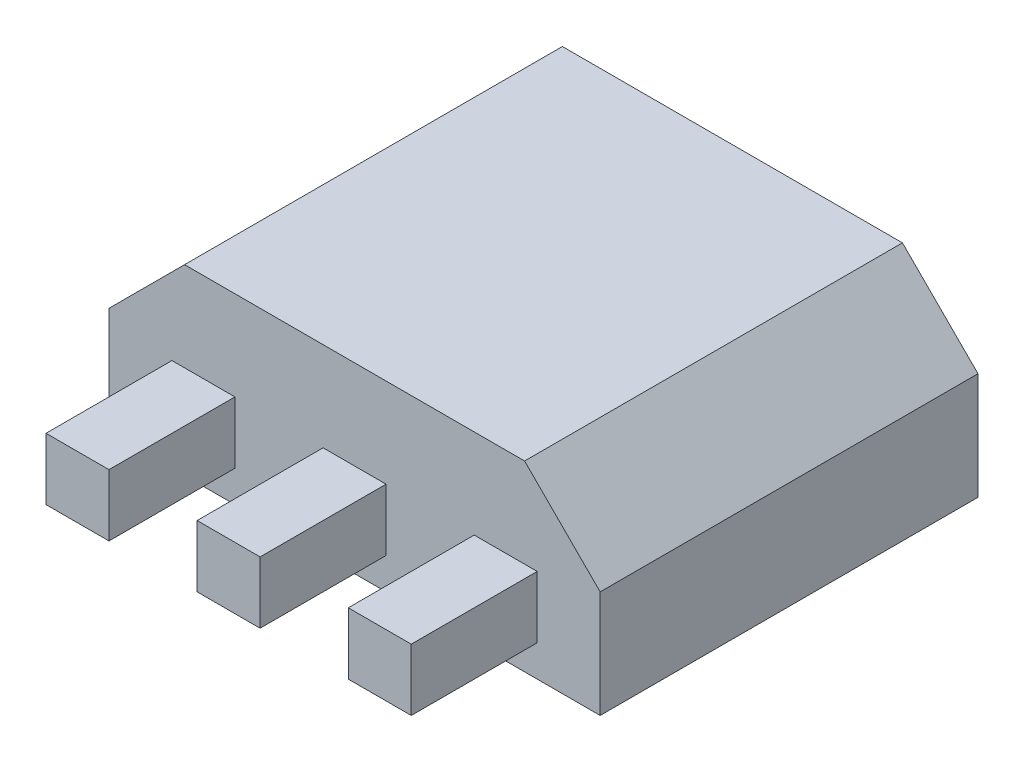
ISO-10303-21;
HEADER;
FILE_DESCRIPTION(('STEP AP214'),'2;1');
FILE_NAME('part.step','',(''),(''),'','','');
FILE_SCHEMA(('AUTOMOTIVE_DESIGN { 1 0 10303 214 1 1 1 1 }'));
ENDSEC;
DATA;
#1=APPLICATION_CONTEXT('core data for automotive mechanical design processes');
#2=APPLICATION_PROTOCOL_DEFINITION('international standard','automotive_design',2000,#1);
#3=PRODUCT_CONTEXT('',#1,'mechanical');
#4=PRODUCT('Part','Part','',(#3));
#5=PRODUCT_RELATED_PRODUCT_CATEGORY('part','',(#4));
#6=PRODUCT_DEFINITION_FORMATION('','',#4);
#7=PRODUCT_DEFINITION_CONTEXT('part definition',#1,'design');
#8=PRODUCT_DEFINITION('design','',#6,#7);
#9=PRODUCT_DEFINITION_SHAPE('','',#8);
#10=(LENGTH_UNIT() NAMED_UNIT(*) SI_UNIT(.MILLI.,.METRE.));
#11=(NAMED_UNIT(*) PLANE_ANGLE_UNIT() SI_UNIT($,.RADIAN.));
#12=(NAMED_UNIT(*) SI_UNIT($,.STERADIAN.) SOLID_ANGLE_UNIT());
#13=UNCERTAINTY_MEASURE_WITH_UNIT(LENGTH_MEASURE(1.E-05),#10,'distance_accuracy_value','');
#14=(GEOMETRIC_REPRESENTATION_CONTEXT(3) GLOBAL_UNCERTAINTY_ASSIGNED_CONTEXT((#13)) GLOBAL_UNIT_ASSIGNED_CONTEXT((#10,
#11,#12)) REPRESENTATION_CONTEXT('',''));
#15=CARTESIAN_POINT('',(0.,0.,0.));
#16=DIRECTION('',(0.,0.,1.));
#17=DIRECTION('',(1.,0.,0.));
#18=AXIS2_PLACEMENT_3D('',#15,#16,#17);
#19=CARTESIAN_POINT('',(0.,1.45,0.));
#20=DIRECTION('',(0.,0.,-1.));
#21=DIRECTION('',(-1.,0.,0.));
#22=AXIS2_PLACEMENT_3D('',#19,#20,#21);
#23=PLANE('',#22);
#24=DIRECTION('',(0.,-1.,0.));
#25=VECTOR('',#24,1.);
#26=CARTESIAN_POINT('',(1.7,0.740574160750156,0.));
#27=LINE('',#26,#25);
#28=CARTESIAN_POINT('',(1.7,0.740574160750156,0.));
#29=VERTEX_POINT('',#28);
#30=CARTESIAN_POINT('',(1.7,0.25,0.));
#31=VERTEX_POINT('',#30);
#32=EDGE_CURVE('E182',#29,#31,#27,.T.);
#33=ORIENTED_EDGE('',*,*,#32,.F.);
#34=DIRECTION('',(-1.,0.,0.));
#35=VECTOR('',#34,1.);
#36=CARTESIAN_POINT('',(1.7,0.740574160750156,0.));
#37=LINE('',#36,#35);
#38=CARTESIAN_POINT('',(2.2,0.740574160750157,0.));
#39=VERTEX_POINT('',#38);
#40=EDGE_CURVE('E195',#39,#29,#37,.T.);
#41=ORIENTED_EDGE('',*,*,#40,.F.);
#42=DIRECTION('',(0.,1.,0.));
#43=VECTOR('',#42,1.);
#44=CARTESIAN_POINT('',(2.2,0.740574160750157,0.));
#45=LINE('',#44,#43);
#46=CARTESIAN_POINT('',(2.2,0.25,0.));
#47=VERTEX_POINT('',#46);
#48=EDGE_CURVE('E204',#47,#39,#45,.T.);
#49=ORIENTED_EDGE('',*,*,#48,.F.);
#50=DIRECTION('',(1.,0.,0.));
#51=VECTOR('',#50,1.);
#52=CARTESIAN_POINT('',(1.7,0.25,0.));
#53=LINE('',#52,#51);
#54=EDGE_CURVE('E185',#31,#47,#53,.T.);
#55=ORIENTED_EDGE('',*,*,#54,.F.);
#56=EDGE_LOOP('',(#33,#41,#49,#55));
#57=FACE_BOUND('',#56,.T.);
#58=DIRECTION('',(1.,0.,0.));
#59=VECTOR('',#58,1.);
#60=CARTESIAN_POINT('',(0.,1.45,0.));
#61=LINE('',#60,#59);
#62=CARTESIAN_POINT('',(0.599999999999999,1.45,0.));
#63=VERTEX_POINT('',#62);
#64=CARTESIAN_POINT('',(3.3,1.45,0.));
#65=VERTEX_POINT('',#64);
#66=EDGE_CURVE('E254',#63,#65,#61,.T.);
#67=ORIENTED_EDGE('',*,*,#66,.F.);
#68=DIRECTION('',(0.707106781186546,0.707106781186549,0.));
#69=VECTOR('',#68,1.);
#70=CARTESIAN_POINT('',(0.599999999999999,1.45,0.));
#71=LINE('',#70,#69);
#72=CARTESIAN_POINT('',(0.,0.849999999999999,0.));
#73=VERTEX_POINT('',#72);
#74=EDGE_CURVE('E287',#63,#73,#71,.F.);
#75=ORIENTED_EDGE('',*,*,#74,.T.);
#76=DIRECTION('',(0.,-1.,0.));
#77=VECTOR('',#76,1.);
#78=CARTESIAN_POINT('',(0.,1.45,0.));
#79=LINE('',#78,#77);
#80=CARTESIAN_POINT('',(0.,0.,0.));
#81=VERTEX_POINT('',#80);
#82=EDGE_CURVE('E277',#73,#81,#79,.T.);
#83=ORIENTED_EDGE('',*,*,#82,.T.);
#84=DIRECTION('',(1.,0.,0.));
#85=VECTOR('',#84,1.);
#86=CARTESIAN_POINT('',(0.,0.,0.));
#87=LINE('',#86,#85);
#88=CARTESIAN_POINT('',(3.9,0.,0.));
#89=VERTEX_POINT('',#88);
#90=EDGE_CURVE('E264',#81,#89,#87,.T.);
#91=ORIENTED_EDGE('',*,*,#90,.T.);
#92=DIRECTION('',(0.,-1.,0.));
#93=VECTOR('',#92,1.);
#94=CARTESIAN_POINT('',(3.9,1.45,0.));
#95=LINE('',#94,#93);
#96=CARTESIAN_POINT('',(3.9,0.849999999999997,0.));
#97=VERTEX_POINT('',#96);
#98=EDGE_CURVE('E275',#97,#89,#95,.T.);
#99=ORIENTED_EDGE('',*,*,#98,.F.);
#100=DIRECTION('',(0.707106781186546,-0.707106781186549,0.));
#101=VECTOR('',#100,1.);
#102=CARTESIAN_POINT('',(3.3,1.45,0.));
#103=LINE('',#102,#101);
#104=EDGE_CURVE('E285',#97,#65,#103,.F.);
#105=ORIENTED_EDGE('',*,*,#104,.T.);
#106=EDGE_LOOP('',(#67,#75,#83,#91,#99,#105));
#107=FACE_BOUND('',#106,.T.);
#108=DIRECTION('',(0.,-1.,0.));
#109=VECTOR('',#108,1.);
#110=CARTESIAN_POINT('',(0.5,0.740574160750157,0.));
#111=LINE('',#110,#109);
#112=CARTESIAN_POINT('',(0.5,0.740574160750157,0.));
#113=VERTEX_POINT('',#112);
#114=CARTESIAN_POINT('',(0.5,0.25,0.));
#115=VERTEX_POINT('',#114);
#116=EDGE_CURVE('E220',#113,#115,#111,.T.);
#117=ORIENTED_EDGE('',*,*,#116,.F.);
#118=DIRECTION('',(-1.,0.,0.));
#119=VECTOR('',#118,1.);
#120=CARTESIAN_POINT('',(0.5,0.740574160750157,0.));
#121=LINE('',#120,#119);
#122=CARTESIAN_POINT('',(1.,0.740574160750157,0.));
#123=VERTEX_POINT('',#122);
#124=EDGE_CURVE('E225',#123,#113,#121,.T.);
#125=ORIENTED_EDGE('',*,*,#124,.F.);
#126=DIRECTION('',(0.,1.,0.));
#127=VECTOR('',#126,1.);
#128=CARTESIAN_POINT('',(1.,0.740574160750157,0.));
#129=LINE('',#128,#127);
#130=CARTESIAN_POINT('',(1.,0.25,0.));
#131=VERTEX_POINT('',#130);
#132=EDGE_CURVE('E237',#131,#123,#129,.T.);
#133=ORIENTED_EDGE('',*,*,#132,.F.);
#134=DIRECTION('',(1.,0.,0.));
#135=VECTOR('',#134,1.);
#136=CARTESIAN_POINT('',(0.5,0.25,0.));
#137=LINE('',#136,#135);
#138=EDGE_CURVE('E234',#115,#131,#137,.T.);
#139=ORIENTED_EDGE('',*,*,#138,.F.);
#140=EDGE_LOOP('',(#117,#125,#133,#139));
#141=FACE_BOUND('',#140,.T.);
#142=DIRECTION('',(0.,-1.,0.));
#143=VECTOR('',#142,1.);
#144=CARTESIAN_POINT('',(2.9,0.740574160750157,0.));
#145=LINE('',#144,#143);
#146=CARTESIAN_POINT('',(2.9,0.740574160750157,0.));
#147=VERTEX_POINT('',#146);
#148=CARTESIAN_POINT('',(2.9,0.25,0.));
#149=VERTEX_POINT('',#148);
#150=EDGE_CURVE('E181',#147,#149,#145,.T.);
#151=ORIENTED_EDGE('',*,*,#150,.F.);
#152=DIRECTION('',(-1.,0.,0.));
#153=VECTOR('',#152,1.);
#154=CARTESIAN_POINT('',(2.9,0.740574160750157,0.));
#155=LINE('',#154,#153);
#156=CARTESIAN_POINT('',(3.4,0.740574160750157,0.));
#157=VERTEX_POINT('',#156);
#158=EDGE_CURVE('E178',#157,#147,#155,.T.);
#159=ORIENTED_EDGE('',*,*,#158,.F.);
#160=DIRECTION('',(0.,1.,0.));
#161=VECTOR('',#160,1.);
#162=CARTESIAN_POINT('',(3.4,0.740574160750157,0.));
#163=LINE('',#162,#161);
#164=CARTESIAN_POINT('',(3.4,0.25,0.));
#165=VERTEX_POINT('',#164);
#166=EDGE_CURVE('E57',#165,#157,#163,.T.);
#167=ORIENTED_EDGE('',*,*,#166,.F.);
#168=DIRECTION('',(1.,0.,0.));
#169=VECTOR('',#168,1.);
#170=CARTESIAN_POINT('',(2.9,0.25,0.));
#171=LINE('',#170,#169);
#172=EDGE_CURVE('E52',#149,#165,#171,.T.);
#173=ORIENTED_EDGE('',*,*,#172,.F.);
#174=EDGE_LOOP('',(#151,#159,#167,#173));
#175=FACE_BOUND('',#174,.T.);
#176=ADVANCED_FACE('F36',(#57,#107,#141,#175),#23,.F.);
#177=CARTESIAN_POINT('',(0.,1.45,0.));
#178=DIRECTION('',(1.,0.,0.));
#179=DIRECTION('',(0.,0.,-1.));
#180=AXIS2_PLACEMENT_3D('',#177,#178,#179);
#181=PLANE('',#180);
#182=ORIENTED_EDGE('',*,*,#82,.F.);
#183=DIRECTION('',(0.,0.,-1.));
#184=VECTOR('',#183,1.);
#185=CARTESIAN_POINT('',(0.,0.849999999999999,0.));
#186=LINE('',#185,#184);
#187=CARTESIAN_POINT('',(0.,0.849999999999999,-3.));
#188=VERTEX_POINT('',#187);
#189=EDGE_CURVE('E289',#73,#188,#186,.T.);
#190=ORIENTED_EDGE('',*,*,#189,.T.);
#191=DIRECTION('',(0.,-1.,0.));
#192=VECTOR('',#191,1.);
#193=CARTESIAN_POINT('',(0.,1.45,-3.));
#194=LINE('',#193,#192);
#195=CARTESIAN_POINT('',(0.,0.,-3.));
#196=VERTEX_POINT('',#195);
#197=EDGE_CURVE('E261',#188,#196,#194,.T.);
#198=ORIENTED_EDGE('',*,*,#197,.T.);
#199=DIRECTION('',(0.,0.,1.));
#200=VECTOR('',#199,1.);
#201=CARTESIAN_POINT('',(0.,0.,0.));
#202=LINE('',#201,#200);
#203=EDGE_CURVE('E253',#196,#81,#202,.T.);
#204=ORIENTED_EDGE('',*,*,#203,.T.);
#205=EDGE_LOOP('',(#182,#190,#198,#204));
#206=FACE_BOUND('',#205,.T.);
#207=ADVANCED_FACE('F310',(#206),#181,.F.);
#208=CARTESIAN_POINT('',(3.9,1.45,0.));
#209=DIRECTION('',(-1.,0.,0.));
#210=DIRECTION('',(0.,0.,1.));
#211=AXIS2_PLACEMENT_3D('',#208,#209,#210);
#212=PLANE('',#211);
#213=DIRECTION('',(0.,-1.,0.));
#214=VECTOR('',#213,1.);
#215=CARTESIAN_POINT('',(3.9,1.45,-3.));
#216=LINE('',#215,#214);
#217=CARTESIAN_POINT('',(3.9,0.849999999999997,-3.));
#218=VERTEX_POINT('',#217);
#219=CARTESIAN_POINT('',(3.9,0.,-3.));
#220=VERTEX_POINT('',#219);
#221=EDGE_CURVE('E273',#218,#220,#216,.T.);
#222=ORIENTED_EDGE('',*,*,#221,.F.);
#223=DIRECTION('',(0.,0.,1.));
#224=VECTOR('',#223,1.);
#225=CARTESIAN_POINT('',(3.9,0.849999999999997,0.));
#226=LINE('',#225,#224);
#227=EDGE_CURVE('E11',#218,#97,#226,.T.);
#228=ORIENTED_EDGE('',*,*,#227,.T.);
#229=ORIENTED_EDGE('',*,*,#98,.T.);
#230=DIRECTION('',(0.,0.,-1.));
#231=VECTOR('',#230,1.);
#232=CARTESIAN_POINT('',(3.9,0.,0.));
#233=LINE('',#232,#231);
#234=EDGE_CURVE('E267',#89,#220,#233,.T.);
#235=ORIENTED_EDGE('',*,*,#234,.T.);
#236=EDGE_LOOP('',(#222,#228,#229,#235));
#237=FACE_BOUND('',#236,.T.);
#238=ADVANCED_FACE('F322',(#237),#212,.F.);
#239=CARTESIAN_POINT('',(0.,1.45,-3.));
#240=DIRECTION('',(0.,0.,1.));
#241=DIRECTION('',(1.,0.,0.));
#242=AXIS2_PLACEMENT_3D('',#239,#240,#241);
#243=PLANE('',#242);
#244=ORIENTED_EDGE('',*,*,#197,.F.);
#245=DIRECTION('',(-0.707106781186546,-0.707106781186549,0.));
#246=VECTOR('',#245,1.);
#247=CARTESIAN_POINT('',(0.599999999999999,1.45,-3.));
#248=LINE('',#247,#246);
#249=CARTESIAN_POINT('',(0.599999999999999,1.45,-3.));
#250=VERTEX_POINT('',#249);
#251=EDGE_CURVE('E45',#188,#250,#248,.F.);
#252=ORIENTED_EDGE('',*,*,#251,.T.);
#253=DIRECTION('',(-1.,0.,0.));
#254=VECTOR('',#253,1.);
#255=CARTESIAN_POINT('',(0.,1.45,-3.));
#256=LINE('',#255,#254);
#257=CARTESIAN_POINT('',(3.3,1.45,-3.));
#258=VERTEX_POINT('',#257);
#259=EDGE_CURVE('E257',#258,#250,#256,.T.);
#260=ORIENTED_EDGE('',*,*,#259,.F.);
#261=DIRECTION('',(-0.707106781186546,0.707106781186549,0.));
#262=VECTOR('',#261,1.);
#263=CARTESIAN_POINT('',(3.3,1.45,-3.));
#264=LINE('',#263,#262);
#265=EDGE_CURVE('E291',#258,#218,#264,.F.);
#266=ORIENTED_EDGE('',*,*,#265,.T.);
#267=ORIENTED_EDGE('',*,*,#221,.T.);
#268=DIRECTION('',(-1.,0.,0.));
#269=VECTOR('',#268,1.);
#270=CARTESIAN_POINT('',(0.,0.,-3.));
#271=LINE('',#270,#269);
#272=EDGE_CURVE('E258',#220,#196,#271,.T.);
#273=ORIENTED_EDGE('',*,*,#272,.T.);
#274=EDGE_LOOP('',(#244,#252,#260,#266,#267,#273));
#275=FACE_BOUND('',#274,.T.);
#276=ADVANCED_FACE('F296',(#275),#243,.F.);
#277=CARTESIAN_POINT('',(0.,1.45,0.));
#278=DIRECTION('',(0.,-1.,0.));
#279=DIRECTION('',(0.,0.,-1.));
#280=AXIS2_PLACEMENT_3D('',#277,#278,#279);
#281=PLANE('',#280);
#282=ORIENTED_EDGE('',*,*,#259,.T.);
#283=DIRECTION('',(0.,0.,1.));
#284=VECTOR('',#283,1.);
#285=CARTESIAN_POINT('',(0.599999999999999,1.45,0.));
#286=LINE('',#285,#284);
#287=EDGE_CURVE('E282',#250,#63,#286,.T.);
#288=ORIENTED_EDGE('',*,*,#287,.T.);
#289=ORIENTED_EDGE('',*,*,#66,.T.);
#290=DIRECTION('',(0.,0.,-1.));
#291=VECTOR('',#290,1.);
#292=CARTESIAN_POINT('',(3.3,1.45,0.));
#293=LINE('',#292,#291);
#294=EDGE_CURVE('E279',#65,#258,#293,.T.);
#295=ORIENTED_EDGE('',*,*,#294,.T.);
#296=EDGE_LOOP('',(#282,#288,#289,#295));
#297=FACE_BOUND('',#296,.T.);
#298=ADVANCED_FACE('F301',(#297),#281,.F.);
#299=CARTESIAN_POINT('',(0.,0.,0.));
#300=DIRECTION('',(0.,-1.,0.));
#301=DIRECTION('',(0.,0.,-1.));
#302=AXIS2_PLACEMENT_3D('',#299,#300,#301);
#303=PLANE('',#302);
#304=ORIENTED_EDGE('',*,*,#203,.F.);
#305=ORIENTED_EDGE('',*,*,#272,.F.);
#306=ORIENTED_EDGE('',*,*,#234,.F.);
#307=ORIENTED_EDGE('',*,*,#90,.F.);
#308=EDGE_LOOP('',(#304,#305,#306,#307));
#309=FACE_BOUND('',#308,.T.);
#310=ADVANCED_FACE('F314',(#309),#303,.T.);
#311=CARTESIAN_POINT('',(0.599999999999999,1.45,0.));
#312=DIRECTION('',(0.707106781186549,-0.707106781186546,0.));
#313=DIRECTION('',(0.,0.,1.));
#314=AXIS2_PLACEMENT_3D('',#311,#312,#313);
#315=PLANE('',#314);
#316=ORIENTED_EDGE('',*,*,#251,.F.);
#317=ORIENTED_EDGE('',*,*,#189,.F.);
#318=ORIENTED_EDGE('',*,*,#74,.F.);
#319=ORIENTED_EDGE('',*,*,#287,.F.);
#320=EDGE_LOOP('',(#316,#317,#318,#319));
#321=FACE_BOUND('',#320,.T.);
#322=ADVANCED_FACE('F304',(#321),#315,.F.);
#323=CARTESIAN_POINT('',(3.3,1.45,0.));
#324=DIRECTION('',(-0.707106781186549,-0.707106781186546,0.));
#325=DIRECTION('',(0.,0.,-1.));
#326=AXIS2_PLACEMENT_3D('',#323,#324,#325);
#327=PLANE('',#326);
#328=ORIENTED_EDGE('',*,*,#104,.F.);
#329=ORIENTED_EDGE('',*,*,#227,.F.);
#330=ORIENTED_EDGE('',*,*,#265,.F.);
#331=ORIENTED_EDGE('',*,*,#294,.F.);
#332=EDGE_LOOP('',(#328,#329,#330,#331));
#333=FACE_BOUND('',#332,.T.);
#334=ADVANCED_FACE('F39',(#333),#327,.F.);
#335=CARTESIAN_POINT('',(0.5,0.740574160750157,1.));
#336=DIRECTION('',(1.,0.,0.));
#337=DIRECTION('',(0.,0.,-1.));
#338=AXIS2_PLACEMENT_3D('',#335,#336,#337);
#339=PLANE('',#338);
#340=ORIENTED_EDGE('',*,*,#116,.T.);
#341=DIRECTION('',(0.,0.,-1.));
#342=VECTOR('',#341,1.);
#343=CARTESIAN_POINT('',(0.5,0.25,1.));
#344=LINE('',#343,#342);
#345=CARTESIAN_POINT('',(0.5,0.25,1.));
#346=VERTEX_POINT('',#345);
#347=EDGE_CURVE('E250',#346,#115,#344,.T.);
#348=ORIENTED_EDGE('',*,*,#347,.F.);
#349=DIRECTION('',(0.,-1.,0.));
#350=VECTOR('',#349,1.);
#351=CARTESIAN_POINT('',(0.5,0.740574160750157,1.));
#352=LINE('',#351,#350);
#353=CARTESIAN_POINT('',(0.5,0.740574160750157,1.));
#354=VERTEX_POINT('',#353);
#355=EDGE_CURVE('E221',#354,#346,#352,.T.);
#356=ORIENTED_EDGE('',*,*,#355,.F.);
#357=DIRECTION('',(0.,0.,-1.));
#358=VECTOR('',#357,1.);
#359=CARTESIAN_POINT('',(0.5,0.740574160750157,1.));
#360=LINE('',#359,#358);
#361=EDGE_CURVE('E231',#354,#113,#360,.T.);
#362=ORIENTED_EDGE('',*,*,#361,.T.);
#363=EDGE_LOOP('',(#340,#348,#356,#362));
#364=FACE_BOUND('',#363,.T.);
#365=ADVANCED_FACE('F344',(#364),#339,.F.);
#366=CARTESIAN_POINT('',(0.5,0.25,1.));
#367=DIRECTION('',(0.,1.,0.));
#368=DIRECTION('',(0.,0.,1.));
#369=AXIS2_PLACEMENT_3D('',#366,#367,#368);
#370=PLANE('',#369);
#371=ORIENTED_EDGE('',*,*,#138,.T.);
#372=DIRECTION('',(0.,0.,-1.));
#373=VECTOR('',#372,1.);
#374=CARTESIAN_POINT('',(1.,0.25,1.));
#375=LINE('',#374,#373);
#376=CARTESIAN_POINT('',(1.,0.25,1.));
#377=VERTEX_POINT('',#376);
#378=EDGE_CURVE('E247',#377,#131,#375,.T.);
#379=ORIENTED_EDGE('',*,*,#378,.F.);
#380=DIRECTION('',(1.,0.,0.));
#381=VECTOR('',#380,1.);
#382=CARTESIAN_POINT('',(0.5,0.25,1.));
#383=LINE('',#382,#381);
#384=EDGE_CURVE('E224',#346,#377,#383,.T.);
#385=ORIENTED_EDGE('',*,*,#384,.F.);
#386=ORIENTED_EDGE('',*,*,#347,.T.);
#387=EDGE_LOOP('',(#371,#379,#385,#386));
#388=FACE_BOUND('',#387,.T.);
#389=ADVANCED_FACE('F353',(#388),#370,.F.);
#390=CARTESIAN_POINT('',(1.,0.740574160750157,1.));
#391=DIRECTION('',(-1.,0.,0.));
#392=DIRECTION('',(0.,0.,1.));
#393=AXIS2_PLACEMENT_3D('',#390,#391,#392);
#394=PLANE('',#393);
#395=ORIENTED_EDGE('',*,*,#132,.T.);
#396=DIRECTION('',(0.,0.,-1.));
#397=VECTOR('',#396,1.);
#398=CARTESIAN_POINT('',(1.,0.740574160750157,1.));
#399=LINE('',#398,#397);
#400=CARTESIAN_POINT('',(1.,0.740574160750157,1.));
#401=VERTEX_POINT('',#400);
#402=EDGE_CURVE('E244',#401,#123,#399,.T.);
#403=ORIENTED_EDGE('',*,*,#402,.F.);
#404=DIRECTION('',(0.,1.,0.));
#405=VECTOR('',#404,1.);
#406=CARTESIAN_POINT('',(1.,0.740574160750157,1.));
#407=LINE('',#406,#405);
#408=EDGE_CURVE('E227',#377,#401,#407,.T.);
#409=ORIENTED_EDGE('',*,*,#408,.F.);
#410=ORIENTED_EDGE('',*,*,#378,.T.);
#411=EDGE_LOOP('',(#395,#403,#409,#410));
#412=FACE_BOUND('',#411,.T.);
#413=ADVANCED_FACE('F357',(#412),#394,.F.);
#414=CARTESIAN_POINT('',(0.5,0.740574160750157,1.));
#415=DIRECTION('',(0.,-1.,0.));
#416=DIRECTION('',(0.,0.,-1.));
#417=AXIS2_PLACEMENT_3D('',#414,#415,#416);
#418=PLANE('',#417);
#419=ORIENTED_EDGE('',*,*,#124,.T.);
#420=ORIENTED_EDGE('',*,*,#361,.F.);
#421=DIRECTION('',(-1.,0.,0.));
#422=VECTOR('',#421,1.);
#423=CARTESIAN_POINT('',(0.5,0.740574160750157,1.));
#424=LINE('',#423,#422);
#425=EDGE_CURVE('E229',#401,#354,#424,.T.);
#426=ORIENTED_EDGE('',*,*,#425,.F.);
#427=ORIENTED_EDGE('',*,*,#402,.T.);
#428=EDGE_LOOP('',(#419,#420,#426,#427));
#429=FACE_BOUND('',#428,.T.);
#430=ADVANCED_FACE('F361',(#429),#418,.F.);
#431=CARTESIAN_POINT('',(0.,0.,1.));
#432=DIRECTION('',(0.,0.,1.));
#433=DIRECTION('',(1.,0.,0.));
#434=AXIS2_PLACEMENT_3D('',#431,#432,#433);
#435=PLANE('',#434);
#436=ORIENTED_EDGE('',*,*,#355,.T.);
#437=ORIENTED_EDGE('',*,*,#384,.T.);
#438=ORIENTED_EDGE('',*,*,#408,.T.);
#439=ORIENTED_EDGE('',*,*,#425,.T.);
#440=EDGE_LOOP('',(#436,#437,#438,#439));
#441=FACE_BOUND('',#440,.T.);
#442=ADVANCED_FACE('F365',(#441),#435,.T.);
#443=CARTESIAN_POINT('',(1.7,0.740574160750156,1.));
#444=DIRECTION('',(1.,0.,0.));
#445=DIRECTION('',(0.,0.,-1.));
#446=AXIS2_PLACEMENT_3D('',#443,#444,#445);
#447=PLANE('',#446);
#448=ORIENTED_EDGE('',*,*,#32,.T.);
#449=DIRECTION('',(0.,0.,-1.));
#450=VECTOR('',#449,1.);
#451=CARTESIAN_POINT('',(1.7,0.25,1.));
#452=LINE('',#451,#450);
#453=CARTESIAN_POINT('',(1.7,0.25,1.));
#454=VERTEX_POINT('',#453);
#455=EDGE_CURVE('E217',#454,#31,#452,.T.);
#456=ORIENTED_EDGE('',*,*,#455,.F.);
#457=DIRECTION('',(0.,-1.,0.));
#458=VECTOR('',#457,1.);
#459=CARTESIAN_POINT('',(1.7,0.740574160750156,1.));
#460=LINE('',#459,#458);
#461=CARTESIAN_POINT('',(1.7,0.740574160750156,1.));
#462=VERTEX_POINT('',#461);
#463=EDGE_CURVE('E191',#462,#454,#460,.T.);
#464=ORIENTED_EDGE('',*,*,#463,.F.);
#465=DIRECTION('',(0.,0.,-1.));
#466=VECTOR('',#465,1.);
#467=CARTESIAN_POINT('',(1.7,0.740574160750156,1.));
#468=LINE('',#467,#466);
#469=EDGE_CURVE('E200',#462,#29,#468,.T.);
#470=ORIENTED_EDGE('',*,*,#469,.T.);
#471=EDGE_LOOP('',(#448,#456,#464,#470));
#472=FACE_BOUND('',#471,.T.);
#473=ADVANCED_FACE('F369',(#472),#447,.F.);
#474=CARTESIAN_POINT('',(1.7,0.25,1.));
#475=DIRECTION('',(0.,1.,0.));
#476=DIRECTION('',(0.,0.,1.));
#477=AXIS2_PLACEMENT_3D('',#474,#475,#476);
#478=PLANE('',#477);
#479=ORIENTED_EDGE('',*,*,#54,.T.);
#480=DIRECTION('',(0.,0.,-1.));
#481=VECTOR('',#480,1.);
#482=CARTESIAN_POINT('',(2.2,0.25,1.));
#483=LINE('',#482,#481);
#484=CARTESIAN_POINT('',(2.2,0.25,1.));
#485=VERTEX_POINT('',#484);
#486=EDGE_CURVE('E214',#485,#47,#483,.T.);
#487=ORIENTED_EDGE('',*,*,#486,.F.);
#488=DIRECTION('',(1.,0.,0.));
#489=VECTOR('',#488,1.);
#490=CARTESIAN_POINT('',(1.7,0.25,1.));
#491=LINE('',#490,#489);
#492=EDGE_CURVE('E194',#454,#485,#491,.T.);
#493=ORIENTED_EDGE('',*,*,#492,.F.);
#494=ORIENTED_EDGE('',*,*,#455,.T.);
#495=EDGE_LOOP('',(#479,#487,#493,#494));
#496=FACE_BOUND('',#495,.T.);
#497=ADVANCED_FACE('F373',(#496),#478,.F.);
#498=CARTESIAN_POINT('',(2.2,0.740574160750157,1.));
#499=DIRECTION('',(-1.,0.,0.));
#500=DIRECTION('',(0.,0.,1.));
#501=AXIS2_PLACEMENT_3D('',#498,#499,#500);
#502=PLANE('',#501);
#503=ORIENTED_EDGE('',*,*,#48,.T.);
#504=DIRECTION('',(0.,0.,-1.));
#505=VECTOR('',#504,1.);
#506=CARTESIAN_POINT('',(2.2,0.740574160750157,1.));
#507=LINE('',#506,#505);
#508=CARTESIAN_POINT('',(2.2,0.740574160750157,1.));
#509=VERTEX_POINT('',#508);
#510=EDGE_CURVE('E211',#509,#39,#507,.T.);
#511=ORIENTED_EDGE('',*,*,#510,.F.);
#512=DIRECTION('',(0.,1.,0.));
#513=VECTOR('',#512,1.);
#514=CARTESIAN_POINT('',(2.2,0.740574160750157,1.));
#515=LINE('',#514,#513);
#516=EDGE_CURVE('E197',#485,#509,#515,.T.);
#517=ORIENTED_EDGE('',*,*,#516,.F.);
#518=ORIENTED_EDGE('',*,*,#486,.T.);
#519=EDGE_LOOP('',(#503,#511,#517,#518));
#520=FACE_BOUND('',#519,.T.);
#521=ADVANCED_FACE('F377',(#520),#502,.F.);
#522=CARTESIAN_POINT('',(1.7,0.740574160750156,1.));
#523=DIRECTION('',(0.,-1.,0.));
#524=DIRECTION('',(1.,0.,0.));
#525=AXIS2_PLACEMENT_3D('',#522,#523,#524);
#526=PLANE('',#525);
#527=ORIENTED_EDGE('',*,*,#40,.T.);
#528=ORIENTED_EDGE('',*,*,#469,.F.);
#529=DIRECTION('',(-1.,0.,0.));
#530=VECTOR('',#529,1.);
#531=CARTESIAN_POINT('',(1.7,0.740574160750156,1.));
#532=LINE('',#531,#530);
#533=EDGE_CURVE('E199',#509,#462,#532,.T.);
#534=ORIENTED_EDGE('',*,*,#533,.F.);
#535=ORIENTED_EDGE('',*,*,#510,.T.);
#536=EDGE_LOOP('',(#527,#528,#534,#535));
#537=FACE_BOUND('',#536,.T.);
#538=ADVANCED_FACE('F381',(#537),#526,.F.);
#539=CARTESIAN_POINT('',(0.,0.,1.));
#540=DIRECTION('',(0.,0.,1.));
#541=DIRECTION('',(1.,0.,0.));
#542=AXIS2_PLACEMENT_3D('',#539,#540,#541);
#543=PLANE('',#542);
#544=ORIENTED_EDGE('',*,*,#463,.T.);
#545=ORIENTED_EDGE('',*,*,#492,.T.);
#546=ORIENTED_EDGE('',*,*,#516,.T.);
#547=ORIENTED_EDGE('',*,*,#533,.T.);
#548=EDGE_LOOP('',(#544,#545,#546,#547));
#549=FACE_BOUND('',#548,.T.);
#550=ADVANCED_FACE('F385',(#549),#543,.T.);
#551=CARTESIAN_POINT('',(2.9,0.740574160750157,1.));
#552=DIRECTION('',(1.,0.,0.));
#553=DIRECTION('',(0.,0.,-1.));
#554=AXIS2_PLACEMENT_3D('',#551,#552,#553);
#555=PLANE('',#554);
#556=ORIENTED_EDGE('',*,*,#150,.T.);
#557=DIRECTION('',(0.,0.,-1.));
#558=VECTOR('',#557,1.);
#559=CARTESIAN_POINT('',(2.9,0.25,1.));
#560=LINE('',#559,#558);
#561=CARTESIAN_POINT('',(2.9,0.25,1.));
#562=VERTEX_POINT('',#561);
#563=EDGE_CURVE('E162',#562,#149,#560,.T.);
#564=ORIENTED_EDGE('',*,*,#563,.F.);
#565=DIRECTION('',(0.,-1.,0.));
#566=VECTOR('',#565,1.);
#567=CARTESIAN_POINT('',(2.9,0.740574160750157,1.));
#568=LINE('',#567,#566);
#569=CARTESIAN_POINT('',(2.9,0.740574160750157,1.));
#570=VERTEX_POINT('',#569);
#571=EDGE_CURVE('E169',#570,#562,#568,.T.);
#572=ORIENTED_EDGE('',*,*,#571,.F.);
#573=DIRECTION('',(0.,0.,-1.));
#574=VECTOR('',#573,1.);
#575=CARTESIAN_POINT('',(2.9,0.740574160750157,1.));
#576=LINE('',#575,#574);
#577=EDGE_CURVE('E535',#570,#147,#576,.T.);
#578=ORIENTED_EDGE('',*,*,#577,.T.);
#579=EDGE_LOOP('',(#556,#564,#572,#578));
#580=FACE_BOUND('',#579,.T.);
#581=ADVANCED_FACE('F180',(#580),#555,.F.);
#582=CARTESIAN_POINT('',(2.9,0.25,1.));
#583=DIRECTION('',(0.,1.,0.));
#584=DIRECTION('',(0.,0.,1.));
#585=AXIS2_PLACEMENT_3D('',#582,#583,#584);
#586=PLANE('',#585);
#587=ORIENTED_EDGE('',*,*,#172,.T.);
#588=DIRECTION('',(0.,0.,-1.));
#589=VECTOR('',#588,1.);
#590=CARTESIAN_POINT('',(3.4,0.25,1.));
#591=LINE('',#590,#589);
#592=CARTESIAN_POINT('',(3.4,0.25,1.));
#593=VERTEX_POINT('',#592);
#594=EDGE_CURVE('E165',#593,#165,#591,.T.);
#595=ORIENTED_EDGE('',*,*,#594,.F.);
#596=DIRECTION('',(1.,0.,0.));
#597=VECTOR('',#596,1.);
#598=CARTESIAN_POINT('',(2.9,0.25,1.));
#599=LINE('',#598,#597);
#600=EDGE_CURVE('E158',#562,#593,#599,.T.);
#601=ORIENTED_EDGE('',*,*,#600,.F.);
#602=ORIENTED_EDGE('',*,*,#563,.T.);
#603=EDGE_LOOP('',(#587,#595,#601,#602));
#604=FACE_BOUND('',#603,.T.);
#605=ADVANCED_FACE('F160',(#604),#586,.F.);
#606=CARTESIAN_POINT('',(3.4,0.740574160750157,1.));
#607=DIRECTION('',(-1.,0.,0.));
#608=DIRECTION('',(0.,0.,1.));
#609=AXIS2_PLACEMENT_3D('',#606,#607,#608);
#610=PLANE('',#609);
#611=ORIENTED_EDGE('',*,*,#166,.T.);
#612=DIRECTION('',(0.,0.,-1.));
#613=VECTOR('',#612,1.);
#614=CARTESIAN_POINT('',(3.4,0.740574160750157,1.));
#615=LINE('',#614,#613);
#616=CARTESIAN_POINT('',(3.4,0.740574160750157,1.));
#617=VERTEX_POINT('',#616);
#618=EDGE_CURVE('E187',#617,#157,#615,.T.);
#619=ORIENTED_EDGE('',*,*,#618,.F.);
#620=DIRECTION('',(0.,1.,0.));
#621=VECTOR('',#620,1.);
#622=CARTESIAN_POINT('',(3.4,0.740574160750157,1.));
#623=LINE('',#622,#621);
#624=EDGE_CURVE('E168',#593,#617,#623,.T.);
#625=ORIENTED_EDGE('',*,*,#624,.F.);
#626=ORIENTED_EDGE('',*,*,#594,.T.);
#627=EDGE_LOOP('',(#611,#619,#625,#626));
#628=FACE_BOUND('',#627,.T.);
#629=ADVANCED_FACE('F394',(#628),#610,.F.);
#630=CARTESIAN_POINT('',(2.9,0.740574160750157,1.));
#631=DIRECTION('',(0.,-1.,0.));
#632=DIRECTION('',(0.,0.,-1.));
#633=AXIS2_PLACEMENT_3D('',#630,#631,#632);
#634=PLANE('',#633);
#635=ORIENTED_EDGE('',*,*,#158,.T.);
#636=ORIENTED_EDGE('',*,*,#577,.F.);
#637=DIRECTION('',(-1.,0.,0.));
#638=VECTOR('',#637,1.);
#639=CARTESIAN_POINT('',(2.9,0.740574160750157,1.));
#640=LINE('',#639,#638);
#641=EDGE_CURVE('E174',#617,#570,#640,.T.);
#642=ORIENTED_EDGE('',*,*,#641,.F.);
#643=ORIENTED_EDGE('',*,*,#618,.T.);
#644=EDGE_LOOP('',(#635,#636,#642,#643));
#645=FACE_BOUND('',#644,.T.);
#646=ADVANCED_FACE('F397',(#645),#634,.F.);
#647=CARTESIAN_POINT('',(0.,0.,1.));
#648=DIRECTION('',(0.,0.,1.));
#649=DIRECTION('',(1.,0.,0.));
#650=AXIS2_PLACEMENT_3D('',#647,#648,#649);
#651=PLANE('',#650);
#652=ORIENTED_EDGE('',*,*,#571,.T.);
#653=ORIENTED_EDGE('',*,*,#600,.T.);
#654=ORIENTED_EDGE('',*,*,#624,.T.);
#655=ORIENTED_EDGE('',*,*,#641,.T.);
#656=EDGE_LOOP('',(#652,#653,#654,#655));
#657=FACE_BOUND('',#656,.T.);
#658=ADVANCED_FACE('F172',(#657),#651,.T.);
#659=CLOSED_SHELL('',(#176,#207,#238,#276,#298,#310,#322,#334,#365,#389,#413,#430,#442,#473,
#497,#521,#538,#550,#581,#605,#629,#646,#658));
#660=MANIFOLD_SOLID_BREP('B2',#659);
#661=ADVANCED_BREP_SHAPE_REPRESENTATION('',(#18,#660),#14);
#662=SHAPE_DEFINITION_REPRESENTATION(#9,#661);
ENDSEC;
END-ISO-10303-21;
